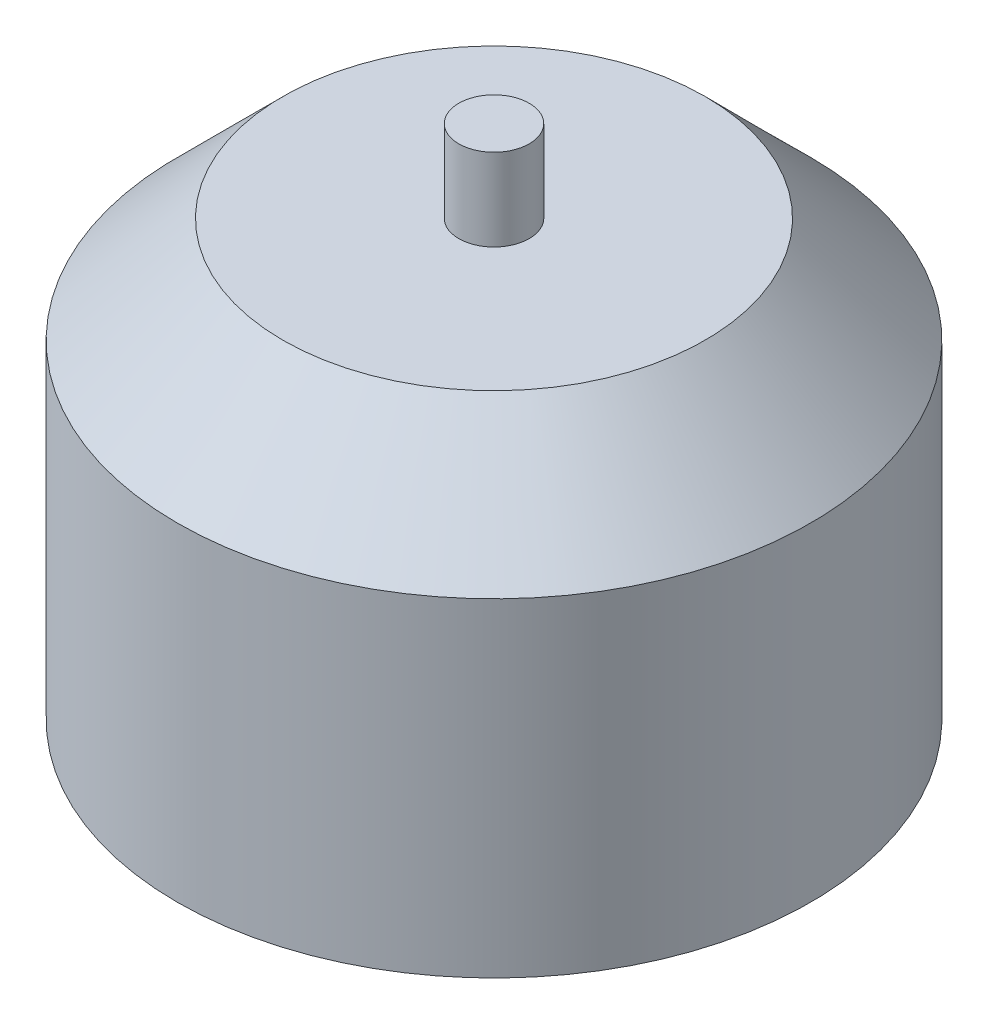
ISO-10303-21;
HEADER;
FILE_DESCRIPTION(('STEP AP214'),'2;1');
FILE_NAME('part.step','',(''),(''),'','','');
FILE_SCHEMA(('AUTOMOTIVE_DESIGN { 1 0 10303 214 1 1 1 1 }'));
ENDSEC;
DATA;
#1=APPLICATION_CONTEXT('core data for automotive mechanical design processes');
#2=APPLICATION_PROTOCOL_DEFINITION('international standard','automotive_design',2000,#1);
#3=PRODUCT_CONTEXT('',#1,'mechanical');
#4=PRODUCT('Part','Part','',(#3));
#5=PRODUCT_RELATED_PRODUCT_CATEGORY('part','',(#4));
#6=PRODUCT_DEFINITION_FORMATION('','',#4);
#7=PRODUCT_DEFINITION_CONTEXT('part definition',#1,'design');
#8=PRODUCT_DEFINITION('design','',#6,#7);
#9=PRODUCT_DEFINITION_SHAPE('','',#8);
#10=(LENGTH_UNIT() NAMED_UNIT(*) SI_UNIT(.MILLI.,.METRE.));
#11=(NAMED_UNIT(*) PLANE_ANGLE_UNIT() SI_UNIT($,.RADIAN.));
#12=(NAMED_UNIT(*) SI_UNIT($,.STERADIAN.) SOLID_ANGLE_UNIT());
#13=UNCERTAINTY_MEASURE_WITH_UNIT(LENGTH_MEASURE(1.E-05),#10,'distance_accuracy_value','');
#14=(GEOMETRIC_REPRESENTATION_CONTEXT(3) GLOBAL_UNCERTAINTY_ASSIGNED_CONTEXT((#13)) GLOBAL_UNIT_ASSIGNED_CONTEXT((#10,
#11,#12)) REPRESENTATION_CONTEXT('',''));
#15=CARTESIAN_POINT('',(0.,0.,0.));
#16=DIRECTION('',(0.,0.,1.));
#17=DIRECTION('',(1.,0.,0.));
#18=AXIS2_PLACEMENT_3D('',#15,#16,#17);
#19=CARTESIAN_POINT('',(0.,18.5,0.));
#20=DIRECTION('',(0.,-1.,0.));
#21=DIRECTION('',(0.,0.,-1.));
#22=AXIS2_PLACEMENT_3D('',#19,#20,#21);
#23=CYLINDRICAL_SURFACE('',#22,13.5);
#24=CARTESIAN_POINT('',(0.,14.,0.));
#25=DIRECTION('',(0.,1.,0.));
#26=DIRECTION('',(0.,0.,1.));
#27=AXIS2_PLACEMENT_3D('',#24,#25,#26);
#28=CIRCLE('',#27,13.5);
#29=CARTESIAN_POINT('',(0.,14.,13.5));
#30=VERTEX_POINT('',#29);
#31=EDGE_CURVE('E47',#30,#30,#28,.T.);
#32=ORIENTED_EDGE('',*,*,#31,.F.);
#33=EDGE_LOOP('',(#32));
#34=FACE_BOUND('',#33,.T.);
#35=CARTESIAN_POINT('',(0.,0.,0.));
#36=DIRECTION('',(0.,1.,0.));
#37=DIRECTION('',(0.,0.,1.));
#38=AXIS2_PLACEMENT_3D('',#35,#36,#37);
#39=CIRCLE('',#38,13.5);
#40=CARTESIAN_POINT('',(0.,0.,13.5));
#41=VERTEX_POINT('',#40);
#42=EDGE_CURVE('E39',#41,#41,#39,.T.);
#43=ORIENTED_EDGE('',*,*,#42,.T.);
#44=EDGE_LOOP('',(#43));
#45=FACE_BOUND('',#44,.T.);
#46=ADVANCED_FACE('F33',(#34,#45),#23,.T.);
#47=CARTESIAN_POINT('',(0.,0.,0.));
#48=DIRECTION('',(0.,1.,0.));
#49=DIRECTION('',(0.,0.,1.));
#50=AXIS2_PLACEMENT_3D('',#47,#48,#49);
#51=PLANE('',#50);
#52=CARTESIAN_POINT('',(0.,0.,0.));
#53=DIRECTION('',(0.,1.,0.));
#54=DIRECTION('',(0.,0.,1.));
#55=AXIS2_PLACEMENT_3D('',#52,#53,#54);
#56=CIRCLE('',#55,1.5);
#57=CARTESIAN_POINT('',(0.,0.,1.5));
#58=VERTEX_POINT('',#57);
#59=EDGE_CURVE('E52',#58,#58,#56,.T.);
#60=ORIENTED_EDGE('',*,*,#59,.T.);
#61=EDGE_LOOP('',(#60));
#62=FACE_BOUND('',#61,.T.);
#63=ORIENTED_EDGE('',*,*,#42,.F.);
#64=EDGE_LOOP('',(#63));
#65=FACE_BOUND('',#64,.T.);
#66=ADVANCED_FACE('F79',(#62,#65),#51,.F.);
#67=CARTESIAN_POINT('',(0.,14.,0.));
#68=DIRECTION('',(0.,-1.,0.));
#69=DIRECTION('',(0.,0.,-1.));
#70=AXIS2_PLACEMENT_3D('',#67,#68,#69);
#71=CONICAL_SURFACE('',#70,13.5,0.785398163397443);
#72=CARTESIAN_POINT('',(0.,18.5,0.));
#73=DIRECTION('',(0.,1.,0.));
#74=DIRECTION('',(0.,0.,1.));
#75=AXIS2_PLACEMENT_3D('',#72,#73,#74);
#76=CIRCLE('',#75,9.00000000000005);
#77=CARTESIAN_POINT('',(0.,18.5,9.00000000000005));
#78=VERTEX_POINT('',#77);
#79=EDGE_CURVE('E43',#78,#78,#76,.T.);
#80=ORIENTED_EDGE('',*,*,#79,.F.);
#81=EDGE_LOOP('',(#80));
#82=FACE_BOUND('',#81,.T.);
#83=ORIENTED_EDGE('',*,*,#31,.T.);
#84=EDGE_LOOP('',(#83));
#85=FACE_BOUND('',#84,.T.);
#86=ADVANCED_FACE('F84',(#82,#85),#71,.T.);
#87=CARTESIAN_POINT('',(0.,18.5,0.));
#88=DIRECTION('',(0.,1.,0.));
#89=DIRECTION('',(0.,0.,1.));
#90=AXIS2_PLACEMENT_3D('',#87,#88,#89);
#91=PLANE('',#90);
#92=CARTESIAN_POINT('',(0.,18.5,0.));
#93=DIRECTION('',(0.,1.,0.));
#94=DIRECTION('',(0.,0.,1.));
#95=AXIS2_PLACEMENT_3D('',#92,#93,#94);
#96=CIRCLE('',#95,1.5);
#97=CARTESIAN_POINT('',(0.,18.5,1.5));
#98=VERTEX_POINT('',#97);
#99=EDGE_CURVE('E11',#98,#98,#96,.T.);
#100=ORIENTED_EDGE('',*,*,#99,.F.);
#101=EDGE_LOOP('',(#100));
#102=FACE_BOUND('',#101,.T.);
#103=ORIENTED_EDGE('',*,*,#79,.T.);
#104=EDGE_LOOP('',(#103));
#105=FACE_BOUND('',#104,.T.);
#106=ADVANCED_FACE('F74',(#102,#105),#91,.T.);
#107=CARTESIAN_POINT('',(0.,22.,0.));
#108=DIRECTION('',(0.,1.,0.));
#109=DIRECTION('',(0.,0.,1.));
#110=AXIS2_PLACEMENT_3D('',#107,#108,#109);
#111=PLANE('',#110);
#112=CARTESIAN_POINT('',(0.,22.,0.));
#113=DIRECTION('',(0.,1.,0.));
#114=DIRECTION('',(0.,0.,1.));
#115=AXIS2_PLACEMENT_3D('',#112,#113,#114);
#116=CIRCLE('',#115,1.5);
#117=CARTESIAN_POINT('',(0.,22.,1.5));
#118=VERTEX_POINT('',#117);
#119=EDGE_CURVE('E58',#118,#118,#116,.T.);
#120=ORIENTED_EDGE('',*,*,#119,.T.);
#121=EDGE_LOOP('',(#120));
#122=FACE_BOUND('',#121,.T.);
#123=ADVANCED_FACE('F62',(#122),#111,.T.);
#124=CARTESIAN_POINT('',(0.,-10.2426406871193,0.));
#125=DIRECTION('',(0.,1.,0.));
#126=DIRECTION('',(0.,0.,1.));
#127=AXIS2_PLACEMENT_3D('',#124,#125,#126);
#128=CYLINDRICAL_SURFACE('',#127,1.5);
#129=ORIENTED_EDGE('',*,*,#99,.T.);
#130=EDGE_LOOP('',(#129));
#131=FACE_BOUND('',#130,.T.);
#132=ORIENTED_EDGE('',*,*,#119,.F.);
#133=EDGE_LOOP('',(#132));
#134=FACE_BOUND('',#133,.T.);
#135=ADVANCED_FACE('F64',(#131,#134),#128,.T.);
#136=CARTESIAN_POINT('',(0.,-3.,0.));
#137=DIRECTION('',(0.,1.,0.));
#138=DIRECTION('',(0.,0.,1.));
#139=AXIS2_PLACEMENT_3D('',#136,#137,#138);
#140=CIRCLE('',#139,1.5);
#141=CARTESIAN_POINT('',(0.,-3.,1.5));
#142=VERTEX_POINT('',#141);
#143=EDGE_CURVE('E55',#142,#142,#140,.F.);
#144=ORIENTED_EDGE('',*,*,#143,.F.);
#145=EDGE_LOOP('',(#144));
#146=FACE_BOUND('',#145,.T.);
#147=ORIENTED_EDGE('',*,*,#59,.F.);
#148=EDGE_LOOP('',(#147));
#149=FACE_BOUND('',#148,.T.);
#150=ADVANCED_FACE('F66',(#146,#149),#128,.T.);
#151=CARTESIAN_POINT('',(0.,-3.,0.));
#152=DIRECTION('',(0.,1.,0.));
#153=DIRECTION('',(0.,0.,1.));
#154=AXIS2_PLACEMENT_3D('',#151,#152,#153);
#155=PLANE('',#154);
#156=ORIENTED_EDGE('',*,*,#143,.T.);
#157=EDGE_LOOP('',(#156));
#158=FACE_BOUND('',#157,.T.);
#159=ADVANCED_FACE('F72',(#158),#155,.F.);
#160=CLOSED_SHELL('',(#46,#66,#86,#106,#123,#135,#150,#159));
#161=MANIFOLD_SOLID_BREP('B2',#160);
#162=ADVANCED_BREP_SHAPE_REPRESENTATION('',(#18,#161),#14);
#163=SHAPE_DEFINITION_REPRESENTATION(#9,#162);
ENDSEC;
END-ISO-10303-21;
